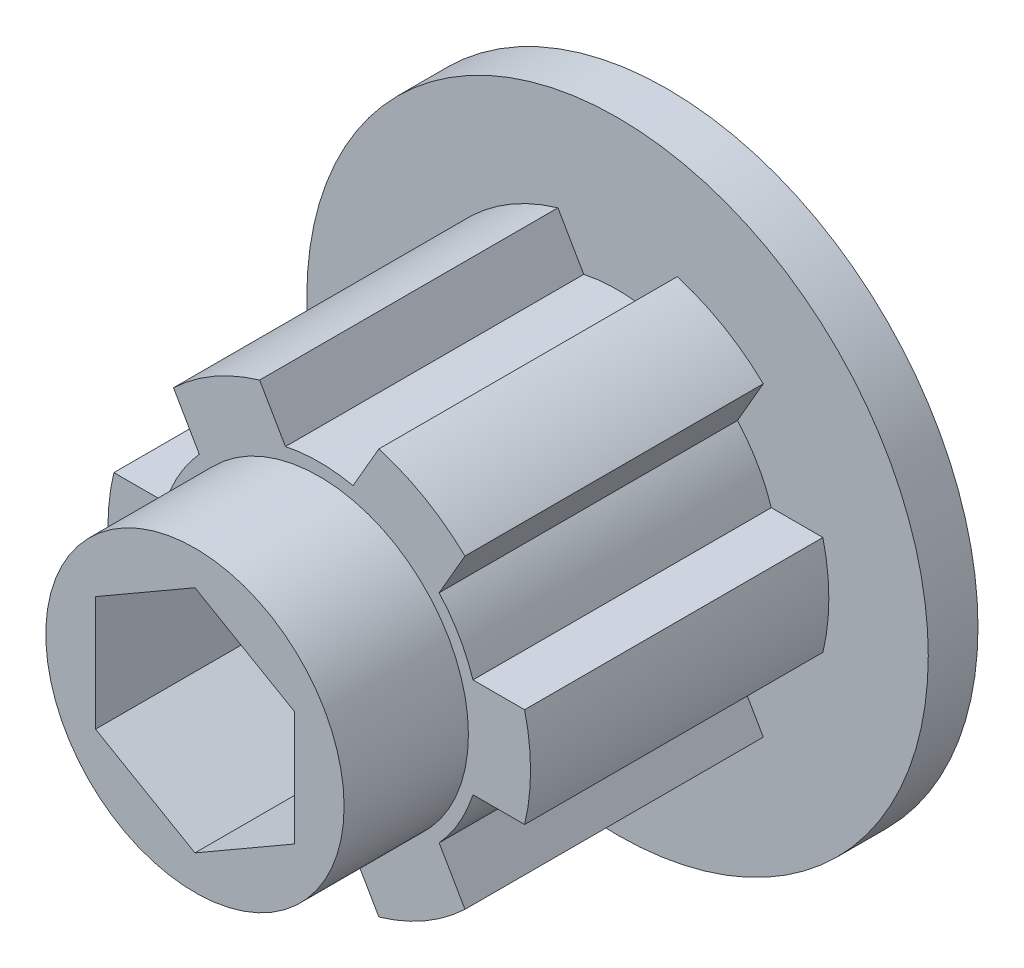
ISO-10303-21;
HEADER;
FILE_DESCRIPTION(('STEP AP214'),'2;1');
FILE_NAME('part.step','',(''),(''),'','','');
FILE_SCHEMA(('AUTOMOTIVE_DESIGN { 1 0 10303 214 1 1 1 1 }'));
ENDSEC;
DATA;
#1=APPLICATION_CONTEXT('core data for automotive mechanical design processes');
#2=APPLICATION_PROTOCOL_DEFINITION('international standard','automotive_design',2000,#1);
#3=PRODUCT_CONTEXT('',#1,'mechanical');
#4=PRODUCT('Part','Part','',(#3));
#5=PRODUCT_RELATED_PRODUCT_CATEGORY('part','',(#4));
#6=PRODUCT_DEFINITION_FORMATION('','',#4);
#7=PRODUCT_DEFINITION_CONTEXT('part definition',#1,'design');
#8=PRODUCT_DEFINITION('design','',#6,#7);
#9=PRODUCT_DEFINITION_SHAPE('','',#8);
#10=(LENGTH_UNIT() NAMED_UNIT(*) SI_UNIT(.MILLI.,.METRE.));
#11=(NAMED_UNIT(*) PLANE_ANGLE_UNIT() SI_UNIT($,.RADIAN.));
#12=(NAMED_UNIT(*) SI_UNIT($,.STERADIAN.) SOLID_ANGLE_UNIT());
#13=UNCERTAINTY_MEASURE_WITH_UNIT(LENGTH_MEASURE(1.E-05),#10,'distance_accuracy_value','');
#14=(GEOMETRIC_REPRESENTATION_CONTEXT(3) GLOBAL_UNCERTAINTY_ASSIGNED_CONTEXT((#13)) GLOBAL_UNIT_ASSIGNED_CONTEXT((#10,
#11,#12)) REPRESENTATION_CONTEXT('',''));
#15=CARTESIAN_POINT('',(0.,0.,0.));
#16=DIRECTION('',(0.,0.,1.));
#17=DIRECTION('',(1.,0.,0.));
#18=AXIS2_PLACEMENT_3D('',#15,#16,#17);
#19=CARTESIAN_POINT('',(0.,0.,2.));
#20=DIRECTION('',(0.,0.,1.));
#21=DIRECTION('',(1.,0.,0.));
#22=AXIS2_PLACEMENT_3D('',#19,#20,#21);
#23=PLANE('',#22);
#24=CARTESIAN_POINT('',(0.,0.,2.));
#25=DIRECTION('',(0.,0.,1.));
#26=DIRECTION('',(1.,0.,0.));
#27=AXIS2_PLACEMENT_3D('',#24,#25,#26);
#28=CIRCLE('',#27,12.5);
#29=CARTESIAN_POINT('',(12.5,0.,2.));
#30=VERTEX_POINT('',#29);
#31=EDGE_CURVE('E26',#30,#30,#28,.T.);
#32=ORIENTED_EDGE('',*,*,#31,.T.);
#33=EDGE_LOOP('',(#32));
#34=FACE_BOUND('',#33,.T.);
#35=CARTESIAN_POINT('',(0.,0.,2.));
#36=DIRECTION('',(0.,0.,1.));
#37=DIRECTION('',(1.,0.,0.));
#38=AXIS2_PLACEMENT_3D('',#35,#36,#37);
#39=CIRCLE('',#38,6.5);
#40=CARTESIAN_POINT('',(1.36027841164437,6.35607132140714,2.));
#41=VERTEX_POINT('',#40);
#42=CARTESIAN_POINT('',(-1.36027841164437,6.35607132140714,2.));
#43=VERTEX_POINT('',#42);
#44=EDGE_CURVE('E511',#41,#43,#39,.T.);
#45=ORIENTED_EDGE('',*,*,#44,.F.);
#46=DIRECTION('',(0.5,0.866025403784439,0.));
#47=VECTOR('',#46,1.);
#48=CARTESIAN_POINT('',(1.87945275727004,7.25530766601711,2.));
#49=LINE('',#48,#47);
#50=CARTESIAN_POINT('',(2.3986271028957,8.15454401062709,2.));
#51=VERTEX_POINT('',#50);
#52=EDGE_CURVE('E356',#41,#51,#49,.T.);
#53=ORIENTED_EDGE('',*,*,#52,.T.);
#54=CARTESIAN_POINT('',(0.,0.,2.));
#55=DIRECTION('',(0.,0.,1.));
#56=DIRECTION('',(1.,0.,0.));
#57=AXIS2_PLACEMENT_3D('',#54,#55,#56);
#58=CIRCLE('',#57,8.5);
#59=CARTESIAN_POINT('',(5.86272871803346,6.15454401062709,2.));
#60=VERTEX_POINT('',#59);
#61=EDGE_CURVE('E444',#60,#51,#58,.T.);
#62=ORIENTED_EDGE('',*,*,#61,.F.);
#63=DIRECTION('',(0.5,0.866025403784439,0.));
#64=VECTOR('',#63,1.);
#65=CARTESIAN_POINT('',(5.34355437240779,5.25530766601711,2.));
#66=LINE('',#65,#64);
#67=CARTESIAN_POINT('',(4.82438002678212,4.35607132140714,2.));
#68=VERTEX_POINT('',#67);
#69=EDGE_CURVE('E440',#68,#60,#66,.T.);
#70=ORIENTED_EDGE('',*,*,#69,.F.);
#71=CARTESIAN_POINT('',(0.,0.,2.));
#72=DIRECTION('',(0.,0.,1.));
#73=DIRECTION('',(1.,0.,0.));
#74=AXIS2_PLACEMENT_3D('',#71,#72,#73);
#75=CIRCLE('',#74,6.5);
#76=CARTESIAN_POINT('',(6.18465843842649,2.,2.));
#77=VERTEX_POINT('',#76);
#78=EDGE_CURVE('E507',#77,#68,#75,.T.);
#79=ORIENTED_EDGE('',*,*,#78,.F.);
#80=DIRECTION('',(1.,0.,0.));
#81=VECTOR('',#80,1.);
#82=CARTESIAN_POINT('',(7.22300712967782,2.,2.));
#83=LINE('',#82,#81);
#84=CARTESIAN_POINT('',(8.26135582092915,2.,2.));
#85=VERTEX_POINT('',#84);
#86=EDGE_CURVE('E492',#77,#85,#83,.T.);
#87=ORIENTED_EDGE('',*,*,#86,.T.);
#88=CARTESIAN_POINT('',(0.,0.,2.));
#89=DIRECTION('',(0.,0.,1.));
#90=DIRECTION('',(1.,0.,0.));
#91=AXIS2_PLACEMENT_3D('',#88,#89,#90);
#92=CIRCLE('',#91,8.5);
#93=CARTESIAN_POINT('',(8.26135582092915,-2.,2.));
#94=VERTEX_POINT('',#93);
#95=EDGE_CURVE('E499',#94,#85,#92,.T.);
#96=ORIENTED_EDGE('',*,*,#95,.F.);
#97=DIRECTION('',(1.,0.,0.));
#98=VECTOR('',#97,1.);
#99=CARTESIAN_POINT('',(7.22300712967782,-2.,2.));
#100=LINE('',#99,#98);
#101=CARTESIAN_POINT('',(6.18465843842649,-2.,2.));
#102=VERTEX_POINT('',#101);
#103=EDGE_CURVE('E495',#102,#94,#100,.T.);
#104=ORIENTED_EDGE('',*,*,#103,.F.);
#105=CARTESIAN_POINT('',(0.,0.,2.));
#106=DIRECTION('',(0.,0.,1.));
#107=DIRECTION('',(1.,0.,0.));
#108=AXIS2_PLACEMENT_3D('',#105,#106,#107);
#109=CIRCLE('',#108,6.5);
#110=CARTESIAN_POINT('',(4.82438002678213,-4.35607132140713,2.));
#111=VERTEX_POINT('',#110);
#112=EDGE_CURVE('E503',#111,#102,#109,.T.);
#113=ORIENTED_EDGE('',*,*,#112,.F.);
#114=DIRECTION('',(0.5,-0.866025403784439,0.));
#115=VECTOR('',#114,1.);
#116=CARTESIAN_POINT('',(5.34355437240779,-5.25530766601711,2.));
#117=LINE('',#116,#115);
#118=CARTESIAN_POINT('',(5.86272871803346,-6.15454401062709,2.));
#119=VERTEX_POINT('',#118);
#120=EDGE_CURVE('E489',#111,#119,#117,.T.);
#121=ORIENTED_EDGE('',*,*,#120,.T.);
#122=CARTESIAN_POINT('',(0.,0.,2.));
#123=DIRECTION('',(0.,0.,1.));
#124=DIRECTION('',(1.,0.,0.));
#125=AXIS2_PLACEMENT_3D('',#122,#123,#124);
#126=CIRCLE('',#125,8.5);
#127=CARTESIAN_POINT('',(2.3986271028957,-8.15454401062709,2.));
#128=VERTEX_POINT('',#127);
#129=EDGE_CURVE('E485',#128,#119,#126,.T.);
#130=ORIENTED_EDGE('',*,*,#129,.F.);
#131=DIRECTION('',(0.5,-0.866025403784439,0.));
#132=VECTOR('',#131,1.);
#133=CARTESIAN_POINT('',(1.87945275727004,-7.25530766601711,2.));
#134=LINE('',#133,#132);
#135=CARTESIAN_POINT('',(1.36027841164436,-6.35607132140714,2.));
#136=VERTEX_POINT('',#135);
#137=EDGE_CURVE('E481',#136,#128,#134,.T.);
#138=ORIENTED_EDGE('',*,*,#137,.F.);
#139=CARTESIAN_POINT('',(0.,0.,2.));
#140=DIRECTION('',(0.,0.,1.));
#141=DIRECTION('',(1.,0.,0.));
#142=AXIS2_PLACEMENT_3D('',#139,#140,#141);
#143=CIRCLE('',#142,6.5);
#144=CARTESIAN_POINT('',(-1.36027841164437,-6.35607132140714,2.));
#145=VERTEX_POINT('',#144);
#146=EDGE_CURVE('E363',#145,#136,#143,.T.);
#147=ORIENTED_EDGE('',*,*,#146,.F.);
#148=DIRECTION('',(-0.5,-0.866025403784439,0.));
#149=VECTOR('',#148,1.);
#150=CARTESIAN_POINT('',(-1.87945275727004,-7.25530766601711,2.));
#151=LINE('',#150,#149);
#152=CARTESIAN_POINT('',(-2.39862710289571,-8.15454401062709,2.));
#153=VERTEX_POINT('',#152);
#154=EDGE_CURVE('E470',#145,#153,#151,.T.);
#155=ORIENTED_EDGE('',*,*,#154,.T.);
#156=CARTESIAN_POINT('',(0.,0.,2.));
#157=DIRECTION('',(0.,0.,1.));
#158=DIRECTION('',(1.,0.,0.));
#159=AXIS2_PLACEMENT_3D('',#156,#157,#158);
#160=CIRCLE('',#159,8.5);
#161=CARTESIAN_POINT('',(-5.86272871803346,-6.15454401062709,2.));
#162=VERTEX_POINT('',#161);
#163=EDGE_CURVE('E477',#162,#153,#160,.T.);
#164=ORIENTED_EDGE('',*,*,#163,.F.);
#165=DIRECTION('',(-0.5,-0.866025403784439,0.));
#166=VECTOR('',#165,1.);
#167=CARTESIAN_POINT('',(-5.34355437240779,-5.25530766601711,2.));
#168=LINE('',#167,#166);
#169=CARTESIAN_POINT('',(-4.82438002678212,-4.35607132140713,2.));
#170=VERTEX_POINT('',#169);
#171=EDGE_CURVE('E473',#170,#162,#168,.T.);
#172=ORIENTED_EDGE('',*,*,#171,.F.);
#173=CARTESIAN_POINT('',(0.,0.,2.));
#174=DIRECTION('',(0.,0.,1.));
#175=DIRECTION('',(1.,0.,0.));
#176=AXIS2_PLACEMENT_3D('',#173,#174,#175);
#177=CIRCLE('',#176,6.5);
#178=CARTESIAN_POINT('',(-6.18465843842649,-2.,2.));
#179=VERTEX_POINT('',#178);
#180=EDGE_CURVE('E519',#179,#170,#177,.T.);
#181=ORIENTED_EDGE('',*,*,#180,.F.);
#182=DIRECTION('',(-1.,0.,0.));
#183=VECTOR('',#182,1.);
#184=CARTESIAN_POINT('',(-7.22300712967782,-2.,2.));
#185=LINE('',#184,#183);
#186=CARTESIAN_POINT('',(-8.26135582092916,-2.,2.));
#187=VERTEX_POINT('',#186);
#188=EDGE_CURVE('E467',#179,#187,#185,.T.);
#189=ORIENTED_EDGE('',*,*,#188,.T.);
#190=CARTESIAN_POINT('',(0.,0.,2.));
#191=DIRECTION('',(0.,0.,1.));
#192=DIRECTION('',(1.,0.,0.));
#193=AXIS2_PLACEMENT_3D('',#190,#191,#192);
#194=CIRCLE('',#193,8.5);
#195=CARTESIAN_POINT('',(-8.26135582092915,2.,2.));
#196=VERTEX_POINT('',#195);
#197=EDGE_CURVE('E463',#196,#187,#194,.T.);
#198=ORIENTED_EDGE('',*,*,#197,.F.);
#199=DIRECTION('',(-1.,0.,0.));
#200=VECTOR('',#199,1.);
#201=CARTESIAN_POINT('',(-7.22300712967782,2.,2.));
#202=LINE('',#201,#200);
#203=CARTESIAN_POINT('',(-6.18465843842649,2.,2.));
#204=VERTEX_POINT('',#203);
#205=EDGE_CURVE('E459',#204,#196,#202,.T.);
#206=ORIENTED_EDGE('',*,*,#205,.F.);
#207=CARTESIAN_POINT('',(0.,0.,2.));
#208=DIRECTION('',(0.,0.,1.));
#209=DIRECTION('',(1.,0.,0.));
#210=AXIS2_PLACEMENT_3D('',#207,#208,#209);
#211=CIRCLE('',#210,6.5);
#212=CARTESIAN_POINT('',(-4.82438002678212,4.35607132140714,2.));
#213=VERTEX_POINT('',#212);
#214=EDGE_CURVE('E515',#213,#204,#211,.T.);
#215=ORIENTED_EDGE('',*,*,#214,.F.);
#216=DIRECTION('',(-0.5,0.866025403784439,0.));
#217=VECTOR('',#216,1.);
#218=CARTESIAN_POINT('',(-5.34355437240779,5.25530766601711,2.));
#219=LINE('',#218,#217);
#220=CARTESIAN_POINT('',(-5.86272871803345,6.15454401062709,2.));
#221=VERTEX_POINT('',#220);
#222=EDGE_CURVE('E448',#213,#221,#219,.T.);
#223=ORIENTED_EDGE('',*,*,#222,.T.);
#224=CARTESIAN_POINT('',(0.,0.,2.));
#225=DIRECTION('',(0.,0.,1.));
#226=DIRECTION('',(1.,0.,0.));
#227=AXIS2_PLACEMENT_3D('',#224,#225,#226);
#228=CIRCLE('',#227,8.5);
#229=CARTESIAN_POINT('',(-2.3986271028957,8.15454401062709,2.));
#230=VERTEX_POINT('',#229);
#231=EDGE_CURVE('E455',#230,#221,#228,.T.);
#232=ORIENTED_EDGE('',*,*,#231,.F.);
#233=DIRECTION('',(-0.5,0.866025403784439,0.));
#234=VECTOR('',#233,1.);
#235=CARTESIAN_POINT('',(-1.87945275727004,7.25530766601712,2.));
#236=LINE('',#235,#234);
#237=EDGE_CURVE('E451',#43,#230,#236,.T.);
#238=ORIENTED_EDGE('',*,*,#237,.F.);
#239=EDGE_LOOP('',(#45,#53,#62,#70,#79,#87,#96,#104,#113,#121,#130,#138,#147,#155,#164,#172,
#181,#189,#198,#206,#215,#223,#232,#238));
#240=FACE_BOUND('',#239,.T.);
#241=ADVANCED_FACE('F16',(#34,#240),#23,.T.);
#242=CARTESIAN_POINT('',(0.,0.,2.));
#243=DIRECTION('',(0.,0.,-1.));
#244=DIRECTION('',(-1.,0.,0.));
#245=AXIS2_PLACEMENT_3D('',#242,#243,#244);
#246=CYLINDRICAL_SURFACE('',#245,12.5);
#247=ORIENTED_EDGE('',*,*,#31,.F.);
#248=EDGE_LOOP('',(#247));
#249=FACE_BOUND('',#248,.T.);
#250=CARTESIAN_POINT('',(0.,0.,0.));
#251=DIRECTION('',(0.,0.,1.));
#252=DIRECTION('',(1.,0.,0.));
#253=AXIS2_PLACEMENT_3D('',#250,#251,#252);
#254=CIRCLE('',#253,12.5);
#255=CARTESIAN_POINT('',(12.5,0.,0.));
#256=VERTEX_POINT('',#255);
#257=EDGE_CURVE('E20',#256,#256,#254,.T.);
#258=ORIENTED_EDGE('',*,*,#257,.T.);
#259=EDGE_LOOP('',(#258));
#260=FACE_BOUND('',#259,.T.);
#261=ADVANCED_FACE('F18',(#249,#260),#246,.T.);
#262=CARTESIAN_POINT('',(0.,0.,0.));
#263=DIRECTION('',(0.,0.,1.));
#264=DIRECTION('',(1.,0.,0.));
#265=AXIS2_PLACEMENT_3D('',#262,#263,#264);
#266=PLANE('',#265);
#267=DIRECTION('',(-0.866025403784438,0.5,0.));
#268=VECTOR('',#267,1.);
#269=CARTESIAN_POINT('',(2.,3.46410161513775,0.));
#270=LINE('',#269,#268);
#271=CARTESIAN_POINT('',(4.,2.3094010767585,0.));
#272=VERTEX_POINT('',#271);
#273=CARTESIAN_POINT('',(0.,4.61880215351701,0.));
#274=VERTEX_POINT('',#273);
#275=EDGE_CURVE('E304',#272,#274,#270,.T.);
#276=ORIENTED_EDGE('',*,*,#275,.T.);
#277=DIRECTION('',(-0.866025403784439,-0.5,0.));
#278=VECTOR('',#277,1.);
#279=CARTESIAN_POINT('',(-2.,3.46410161513775,0.));
#280=LINE('',#279,#278);
#281=CARTESIAN_POINT('',(-4.,2.30940107675851,0.));
#282=VERTEX_POINT('',#281);
#283=EDGE_CURVE('E39',#274,#282,#280,.T.);
#284=ORIENTED_EDGE('',*,*,#283,.T.);
#285=DIRECTION('',(0.,-1.,0.));
#286=VECTOR('',#285,1.);
#287=CARTESIAN_POINT('',(-4.,0.,0.));
#288=LINE('',#287,#286);
#289=CARTESIAN_POINT('',(-4.,-2.30940107675851,0.));
#290=VERTEX_POINT('',#289);
#291=EDGE_CURVE('E291',#282,#290,#288,.T.);
#292=ORIENTED_EDGE('',*,*,#291,.T.);
#293=DIRECTION('',(0.866025403784439,-0.5,0.));
#294=VECTOR('',#293,1.);
#295=CARTESIAN_POINT('',(-2.,-3.46410161513775,0.));
#296=LINE('',#295,#294);
#297=CARTESIAN_POINT('',(0.,-4.61880215351701,0.));
#298=VERTEX_POINT('',#297);
#299=EDGE_CURVE('E297',#290,#298,#296,.T.);
#300=ORIENTED_EDGE('',*,*,#299,.T.);
#301=DIRECTION('',(0.866025403784439,0.5,0.));
#302=VECTOR('',#301,1.);
#303=CARTESIAN_POINT('',(2.,-3.46410161513775,0.));
#304=LINE('',#303,#302);
#305=CARTESIAN_POINT('',(4.,-2.30940107675851,0.));
#306=VERTEX_POINT('',#305);
#307=EDGE_CURVE('E317',#298,#306,#304,.T.);
#308=ORIENTED_EDGE('',*,*,#307,.T.);
#309=DIRECTION('',(0.,1.,0.));
#310=VECTOR('',#309,1.);
#311=CARTESIAN_POINT('',(4.,0.,0.));
#312=LINE('',#311,#310);
#313=EDGE_CURVE('E321',#306,#272,#312,.T.);
#314=ORIENTED_EDGE('',*,*,#313,.T.);
#315=EDGE_LOOP('',(#276,#284,#292,#300,#308,#314));
#316=FACE_BOUND('',#315,.T.);
#317=ORIENTED_EDGE('',*,*,#257,.F.);
#318=EDGE_LOOP('',(#317));
#319=FACE_BOUND('',#318,.T.);
#320=ADVANCED_FACE('F300',(#316,#319),#266,.F.);
#321=CARTESIAN_POINT('',(1.87945275727004,7.25530766601711,14.));
#322=DIRECTION('',(-0.866025403784438,0.5,0.));
#323=DIRECTION('',(-0.5,-0.866025403784439,0.));
#324=AXIS2_PLACEMENT_3D('',#321,#322,#323);
#325=PLANE('',#324);
#326=ORIENTED_EDGE('',*,*,#52,.F.);
#327=DIRECTION('',(0.,0.,-1.));
#328=VECTOR('',#327,1.);
#329=CARTESIAN_POINT('',(1.36027841164437,6.35607132140714,14.));
#330=LINE('',#329,#328);
#331=CARTESIAN_POINT('',(1.36027841164437,6.35607132140714,14.));
#332=VERTEX_POINT('',#331);
#333=EDGE_CURVE('E604',#332,#41,#330,.T.);
#334=ORIENTED_EDGE('',*,*,#333,.F.);
#335=DIRECTION('',(0.5,0.866025403784439,0.));
#336=VECTOR('',#335,1.);
#337=CARTESIAN_POINT('',(1.87945275727004,7.25530766601711,14.));
#338=LINE('',#337,#336);
#339=CARTESIAN_POINT('',(2.3986271028957,8.15454401062709,14.));
#340=VERTEX_POINT('',#339);
#341=EDGE_CURVE('E358',#332,#340,#338,.T.);
#342=ORIENTED_EDGE('',*,*,#341,.T.);
#343=DIRECTION('',(0.,0.,-1.));
#344=VECTOR('',#343,1.);
#345=CARTESIAN_POINT('',(2.3986271028957,8.15454401062709,14.));
#346=LINE('',#345,#344);
#347=EDGE_CURVE('E437',#340,#51,#346,.T.);
#348=ORIENTED_EDGE('',*,*,#347,.T.);
#349=EDGE_LOOP('',(#326,#334,#342,#348));
#350=FACE_BOUND('',#349,.T.);
#351=ADVANCED_FACE('F632',(#350),#325,.T.);
#352=CARTESIAN_POINT('',(0.,0.,14.));
#353=DIRECTION('',(0.,0.,-1.));
#354=DIRECTION('',(-1.,0.,0.));
#355=AXIS2_PLACEMENT_3D('',#352,#353,#354);
#356=CYLINDRICAL_SURFACE('',#355,6.5);
#357=ORIENTED_EDGE('',*,*,#44,.T.);
#358=DIRECTION('',(0.,0.,-1.));
#359=VECTOR('',#358,1.);
#360=CARTESIAN_POINT('',(-1.36027841164437,6.35607132140714,14.));
#361=LINE('',#360,#359);
#362=CARTESIAN_POINT('',(-1.36027841164437,6.35607132140714,14.));
#363=VERTEX_POINT('',#362);
#364=EDGE_CURVE('E600',#363,#43,#361,.T.);
#365=ORIENTED_EDGE('',*,*,#364,.F.);
#366=CARTESIAN_POINT('',(0.,0.,14.));
#367=DIRECTION('',(0.,0.,1.));
#368=DIRECTION('',(1.,0.,0.));
#369=AXIS2_PLACEMENT_3D('',#366,#367,#368);
#370=CIRCLE('',#369,6.5);
#371=EDGE_CURVE('E425',#332,#363,#370,.T.);
#372=ORIENTED_EDGE('',*,*,#371,.F.);
#373=ORIENTED_EDGE('',*,*,#333,.T.);
#374=EDGE_LOOP('',(#357,#365,#372,#373));
#375=FACE_BOUND('',#374,.T.);
#376=ADVANCED_FACE('F638',(#375),#356,.T.);
#377=CARTESIAN_POINT('',(-1.87945275727004,7.25530766601712,14.));
#378=DIRECTION('',(-0.866025403784439,-0.5,0.));
#379=DIRECTION('',(0.5,-0.866025403784439,0.));
#380=AXIS2_PLACEMENT_3D('',#377,#378,#379);
#381=PLANE('',#380);
#382=ORIENTED_EDGE('',*,*,#237,.T.);
#383=DIRECTION('',(0.,0.,-1.));
#384=VECTOR('',#383,1.);
#385=CARTESIAN_POINT('',(-2.3986271028957,8.15454401062709,14.));
#386=LINE('',#385,#384);
#387=CARTESIAN_POINT('',(-2.3986271028957,8.15454401062709,14.));
#388=VERTEX_POINT('',#387);
#389=EDGE_CURVE('E596',#388,#230,#386,.T.);
#390=ORIENTED_EDGE('',*,*,#389,.F.);
#391=DIRECTION('',(-0.5,0.866025403784439,0.));
#392=VECTOR('',#391,1.);
#393=CARTESIAN_POINT('',(-1.87945275727004,7.25530766601712,14.));
#394=LINE('',#393,#392);
#395=EDGE_CURVE('E373',#363,#388,#394,.T.);
#396=ORIENTED_EDGE('',*,*,#395,.F.);
#397=ORIENTED_EDGE('',*,*,#364,.T.);
#398=EDGE_LOOP('',(#382,#390,#396,#397));
#399=FACE_BOUND('',#398,.T.);
#400=ADVANCED_FACE('F664',(#399),#381,.F.);
#401=CARTESIAN_POINT('',(0.,0.,14.));
#402=DIRECTION('',(0.,0.,-1.));
#403=DIRECTION('',(-1.,0.,0.));
#404=AXIS2_PLACEMENT_3D('',#401,#402,#403);
#405=CYLINDRICAL_SURFACE('',#404,8.5);
#406=ORIENTED_EDGE('',*,*,#231,.T.);
#407=DIRECTION('',(0.,0.,-1.));
#408=VECTOR('',#407,1.);
#409=CARTESIAN_POINT('',(-5.86272871803345,6.15454401062709,14.));
#410=LINE('',#409,#408);
#411=CARTESIAN_POINT('',(-5.86272871803345,6.15454401062709,14.));
#412=VERTEX_POINT('',#411);
#413=EDGE_CURVE('E592',#412,#221,#410,.T.);
#414=ORIENTED_EDGE('',*,*,#413,.F.);
#415=CARTESIAN_POINT('',(0.,0.,14.));
#416=DIRECTION('',(0.,0.,1.));
#417=DIRECTION('',(1.,0.,0.));
#418=AXIS2_PLACEMENT_3D('',#415,#416,#417);
#419=CIRCLE('',#418,8.5);
#420=EDGE_CURVE('E376',#388,#412,#419,.T.);
#421=ORIENTED_EDGE('',*,*,#420,.F.);
#422=ORIENTED_EDGE('',*,*,#389,.T.);
#423=EDGE_LOOP('',(#406,#414,#421,#422));
#424=FACE_BOUND('',#423,.T.);
#425=ADVANCED_FACE('F662',(#424),#405,.T.);
#426=CARTESIAN_POINT('',(-5.34355437240779,5.25530766601711,14.));
#427=DIRECTION('',(-0.866025403784439,-0.5,0.));
#428=DIRECTION('',(0.5,-0.866025403784439,0.));
#429=AXIS2_PLACEMENT_3D('',#426,#427,#428);
#430=PLANE('',#429);
#431=ORIENTED_EDGE('',*,*,#222,.F.);
#432=DIRECTION('',(0.,0.,-1.));
#433=VECTOR('',#432,1.);
#434=CARTESIAN_POINT('',(-4.82438002678212,4.35607132140714,14.));
#435=LINE('',#434,#433);
#436=CARTESIAN_POINT('',(-4.82438002678212,4.35607132140714,14.));
#437=VERTEX_POINT('',#436);
#438=EDGE_CURVE('E591',#437,#213,#435,.T.);
#439=ORIENTED_EDGE('',*,*,#438,.F.);
#440=DIRECTION('',(-0.5,0.866025403784439,0.));
#441=VECTOR('',#440,1.);
#442=CARTESIAN_POINT('',(-5.34355437240779,5.25530766601711,14.));
#443=LINE('',#442,#441);
#444=EDGE_CURVE('E369',#437,#412,#443,.T.);
#445=ORIENTED_EDGE('',*,*,#444,.T.);
#446=ORIENTED_EDGE('',*,*,#413,.T.);
#447=EDGE_LOOP('',(#431,#439,#445,#446));
#448=FACE_BOUND('',#447,.T.);
#449=ADVANCED_FACE('F658',(#448),#430,.T.);
#450=CARTESIAN_POINT('',(0.,0.,14.));
#451=DIRECTION('',(0.,0.,-1.));
#452=DIRECTION('',(-1.,0.,0.));
#453=AXIS2_PLACEMENT_3D('',#450,#451,#452);
#454=CYLINDRICAL_SURFACE('',#453,6.5);
#455=ORIENTED_EDGE('',*,*,#214,.T.);
#456=DIRECTION('',(0.,0.,-1.));
#457=VECTOR('',#456,1.);
#458=CARTESIAN_POINT('',(-6.18465843842649,2.,14.));
#459=LINE('',#458,#457);
#460=CARTESIAN_POINT('',(-6.18465843842649,2.,14.));
#461=VERTEX_POINT('',#460);
#462=EDGE_CURVE('E587',#461,#204,#459,.T.);
#463=ORIENTED_EDGE('',*,*,#462,.F.);
#464=CARTESIAN_POINT('',(0.,0.,14.));
#465=DIRECTION('',(0.,0.,1.));
#466=DIRECTION('',(1.,0.,0.));
#467=AXIS2_PLACEMENT_3D('',#464,#465,#466);
#468=CIRCLE('',#467,6.5);
#469=EDGE_CURVE('E428',#437,#461,#468,.T.);
#470=ORIENTED_EDGE('',*,*,#469,.F.);
#471=ORIENTED_EDGE('',*,*,#438,.T.);
#472=EDGE_LOOP('',(#455,#463,#470,#471));
#473=FACE_BOUND('',#472,.T.);
#474=ADVANCED_FACE('F661',(#473),#454,.T.);
#475=CARTESIAN_POINT('',(-7.22300712967782,2.,14.));
#476=DIRECTION('',(0.,-1.,0.));
#477=DIRECTION('',(0.,0.,-1.));
#478=AXIS2_PLACEMENT_3D('',#475,#476,#477);
#479=PLANE('',#478);
#480=ORIENTED_EDGE('',*,*,#205,.T.);
#481=DIRECTION('',(0.,0.,-1.));
#482=VECTOR('',#481,1.);
#483=CARTESIAN_POINT('',(-8.26135582092915,2.,14.));
#484=LINE('',#483,#482);
#485=CARTESIAN_POINT('',(-8.26135582092915,2.,14.));
#486=VERTEX_POINT('',#485);
#487=EDGE_CURVE('E583',#486,#196,#484,.T.);
#488=ORIENTED_EDGE('',*,*,#487,.F.);
#489=DIRECTION('',(-1.,0.,0.));
#490=VECTOR('',#489,1.);
#491=CARTESIAN_POINT('',(-7.22300712967782,2.,14.));
#492=LINE('',#491,#490);
#493=EDGE_CURVE('E379',#461,#486,#492,.T.);
#494=ORIENTED_EDGE('',*,*,#493,.F.);
#495=ORIENTED_EDGE('',*,*,#462,.T.);
#496=EDGE_LOOP('',(#480,#488,#494,#495));
#497=FACE_BOUND('',#496,.T.);
#498=ADVANCED_FACE('F671',(#497),#479,.F.);
#499=CARTESIAN_POINT('',(0.,0.,14.));
#500=DIRECTION('',(0.,0.,-1.));
#501=DIRECTION('',(-1.,0.,0.));
#502=AXIS2_PLACEMENT_3D('',#499,#500,#501);
#503=CYLINDRICAL_SURFACE('',#502,8.5);
#504=ORIENTED_EDGE('',*,*,#197,.T.);
#505=DIRECTION('',(0.,0.,-1.));
#506=VECTOR('',#505,1.);
#507=CARTESIAN_POINT('',(-8.26135582092916,-2.,14.));
#508=LINE('',#507,#506);
#509=CARTESIAN_POINT('',(-8.26135582092916,-2.,14.));
#510=VERTEX_POINT('',#509);
#511=EDGE_CURVE('E579',#510,#187,#508,.T.);
#512=ORIENTED_EDGE('',*,*,#511,.F.);
#513=CARTESIAN_POINT('',(0.,0.,14.));
#514=DIRECTION('',(0.,0.,1.));
#515=DIRECTION('',(1.,0.,0.));
#516=AXIS2_PLACEMENT_3D('',#513,#514,#515);
#517=CIRCLE('',#516,8.5);
#518=EDGE_CURVE('E382',#486,#510,#517,.T.);
#519=ORIENTED_EDGE('',*,*,#518,.F.);
#520=ORIENTED_EDGE('',*,*,#487,.T.);
#521=EDGE_LOOP('',(#504,#512,#519,#520));
#522=FACE_BOUND('',#521,.T.);
#523=ADVANCED_FACE('F674',(#522),#503,.T.);
#524=CARTESIAN_POINT('',(-7.22300712967782,-2.,14.));
#525=DIRECTION('',(0.,-1.,0.));
#526=DIRECTION('',(0.,0.,-1.));
#527=AXIS2_PLACEMENT_3D('',#524,#525,#526);
#528=PLANE('',#527);
#529=ORIENTED_EDGE('',*,*,#188,.F.);
#530=DIRECTION('',(0.,0.,-1.));
#531=VECTOR('',#530,1.);
#532=CARTESIAN_POINT('',(-6.18465843842649,-2.,14.));
#533=LINE('',#532,#531);
#534=CARTESIAN_POINT('',(-6.18465843842649,-2.,14.));
#535=VERTEX_POINT('',#534);
#536=EDGE_CURVE('E572',#535,#179,#533,.T.);
#537=ORIENTED_EDGE('',*,*,#536,.F.);
#538=DIRECTION('',(-1.,0.,0.));
#539=VECTOR('',#538,1.);
#540=CARTESIAN_POINT('',(-7.22300712967782,-2.,14.));
#541=LINE('',#540,#539);
#542=EDGE_CURVE('E385',#535,#510,#541,.T.);
#543=ORIENTED_EDGE('',*,*,#542,.T.);
#544=ORIENTED_EDGE('',*,*,#511,.T.);
#545=EDGE_LOOP('',(#529,#537,#543,#544));
#546=FACE_BOUND('',#545,.T.);
#547=ADVANCED_FACE('F678',(#546),#528,.T.);
#548=CARTESIAN_POINT('',(0.,0.,14.));
#549=DIRECTION('',(0.,0.,-1.));
#550=DIRECTION('',(-1.,0.,0.));
#551=AXIS2_PLACEMENT_3D('',#548,#549,#550);
#552=CYLINDRICAL_SURFACE('',#551,6.5);
#553=ORIENTED_EDGE('',*,*,#180,.T.);
#554=DIRECTION('',(0.,0.,-1.));
#555=VECTOR('',#554,1.);
#556=CARTESIAN_POINT('',(-4.82438002678212,-4.35607132140713,14.));
#557=LINE('',#556,#555);
#558=CARTESIAN_POINT('',(-4.82438002678212,-4.35607132140713,14.));
#559=VERTEX_POINT('',#558);
#560=EDGE_CURVE('E568',#559,#170,#557,.T.);
#561=ORIENTED_EDGE('',*,*,#560,.F.);
#562=CARTESIAN_POINT('',(0.,0.,14.));
#563=DIRECTION('',(0.,0.,1.));
#564=DIRECTION('',(1.,0.,0.));
#565=AXIS2_PLACEMENT_3D('',#562,#563,#564);
#566=CIRCLE('',#565,6.5);
#567=EDGE_CURVE('E431',#535,#559,#566,.T.);
#568=ORIENTED_EDGE('',*,*,#567,.F.);
#569=ORIENTED_EDGE('',*,*,#536,.T.);
#570=EDGE_LOOP('',(#553,#561,#568,#569));
#571=FACE_BOUND('',#570,.T.);
#572=ADVANCED_FACE('F682',(#571),#552,.T.);
#573=CARTESIAN_POINT('',(-5.34355437240779,-5.25530766601711,14.));
#574=DIRECTION('',(0.866025403784438,-0.5,0.));
#575=DIRECTION('',(0.5,0.866025403784439,0.));
#576=AXIS2_PLACEMENT_3D('',#573,#574,#575);
#577=PLANE('',#576);
#578=ORIENTED_EDGE('',*,*,#171,.T.);
#579=DIRECTION('',(0.,0.,-1.));
#580=VECTOR('',#579,1.);
#581=CARTESIAN_POINT('',(-5.86272871803346,-6.15454401062709,14.));
#582=LINE('',#581,#580);
#583=CARTESIAN_POINT('',(-5.86272871803346,-6.15454401062709,14.));
#584=VERTEX_POINT('',#583);
#585=EDGE_CURVE('E564',#584,#162,#582,.T.);
#586=ORIENTED_EDGE('',*,*,#585,.F.);
#587=DIRECTION('',(-0.5,-0.866025403784439,0.));
#588=VECTOR('',#587,1.);
#589=CARTESIAN_POINT('',(-5.34355437240779,-5.25530766601711,14.));
#590=LINE('',#589,#588);
#591=EDGE_CURVE('E393',#559,#584,#590,.T.);
#592=ORIENTED_EDGE('',*,*,#591,.F.);
#593=ORIENTED_EDGE('',*,*,#560,.T.);
#594=EDGE_LOOP('',(#578,#586,#592,#593));
#595=FACE_BOUND('',#594,.T.);
#596=ADVANCED_FACE('F690',(#595),#577,.F.);
#597=CARTESIAN_POINT('',(0.,0.,14.));
#598=DIRECTION('',(0.,0.,-1.));
#599=DIRECTION('',(-1.,0.,0.));
#600=AXIS2_PLACEMENT_3D('',#597,#598,#599);
#601=CYLINDRICAL_SURFACE('',#600,8.5);
#602=ORIENTED_EDGE('',*,*,#163,.T.);
#603=DIRECTION('',(0.,0.,-1.));
#604=VECTOR('',#603,1.);
#605=CARTESIAN_POINT('',(-2.39862710289571,-8.15454401062709,14.));
#606=LINE('',#605,#604);
#607=CARTESIAN_POINT('',(-2.39862710289571,-8.15454401062709,14.));
#608=VERTEX_POINT('',#607);
#609=EDGE_CURVE('E560',#608,#153,#606,.T.);
#610=ORIENTED_EDGE('',*,*,#609,.F.);
#611=CARTESIAN_POINT('',(0.,0.,14.));
#612=DIRECTION('',(0.,0.,1.));
#613=DIRECTION('',(1.,0.,0.));
#614=AXIS2_PLACEMENT_3D('',#611,#612,#613);
#615=CIRCLE('',#614,8.5);
#616=EDGE_CURVE('E396',#584,#608,#615,.T.);
#617=ORIENTED_EDGE('',*,*,#616,.F.);
#618=ORIENTED_EDGE('',*,*,#585,.T.);
#619=EDGE_LOOP('',(#602,#610,#617,#618));
#620=FACE_BOUND('',#619,.T.);
#621=ADVANCED_FACE('F688',(#620),#601,.T.);
#622=CARTESIAN_POINT('',(-1.87945275727004,-7.25530766601711,14.));
#623=DIRECTION('',(0.866025403784438,-0.5,0.));
#624=DIRECTION('',(0.5,0.866025403784439,0.));
#625=AXIS2_PLACEMENT_3D('',#622,#623,#624);
#626=PLANE('',#625);
#627=ORIENTED_EDGE('',*,*,#154,.F.);
#628=DIRECTION('',(0.,0.,-1.));
#629=VECTOR('',#628,1.);
#630=CARTESIAN_POINT('',(-1.36027841164437,-6.35607132140714,14.));
#631=LINE('',#630,#629);
#632=CARTESIAN_POINT('',(-1.36027841164437,-6.35607132140714,14.));
#633=VERTEX_POINT('',#632);
#634=EDGE_CURVE('E559',#633,#145,#631,.T.);
#635=ORIENTED_EDGE('',*,*,#634,.F.);
#636=DIRECTION('',(-0.5,-0.866025403784439,0.));
#637=VECTOR('',#636,1.);
#638=CARTESIAN_POINT('',(-1.87945275727004,-7.25530766601711,14.));
#639=LINE('',#638,#637);
#640=EDGE_CURVE('E389',#633,#608,#639,.T.);
#641=ORIENTED_EDGE('',*,*,#640,.T.);
#642=ORIENTED_EDGE('',*,*,#609,.T.);
#643=EDGE_LOOP('',(#627,#635,#641,#642));
#644=FACE_BOUND('',#643,.T.);
#645=ADVANCED_FACE('F684',(#644),#626,.T.);
#646=CARTESIAN_POINT('',(0.,0.,14.));
#647=DIRECTION('',(0.,0.,-1.));
#648=DIRECTION('',(-1.,0.,0.));
#649=AXIS2_PLACEMENT_3D('',#646,#647,#648);
#650=CYLINDRICAL_SURFACE('',#649,6.5);
#651=ORIENTED_EDGE('',*,*,#146,.T.);
#652=DIRECTION('',(0.,0.,-1.));
#653=VECTOR('',#652,1.);
#654=CARTESIAN_POINT('',(1.36027841164436,-6.35607132140714,14.));
#655=LINE('',#654,#653);
#656=CARTESIAN_POINT('',(1.36027841164436,-6.35607132140714,14.));
#657=VERTEX_POINT('',#656);
#658=EDGE_CURVE('E555',#657,#136,#655,.T.);
#659=ORIENTED_EDGE('',*,*,#658,.F.);
#660=CARTESIAN_POINT('',(0.,0.,14.));
#661=DIRECTION('',(0.,0.,1.));
#662=DIRECTION('',(1.,0.,0.));
#663=AXIS2_PLACEMENT_3D('',#660,#661,#662);
#664=CIRCLE('',#663,6.5);
#665=EDGE_CURVE('E434',#633,#657,#664,.T.);
#666=ORIENTED_EDGE('',*,*,#665,.F.);
#667=ORIENTED_EDGE('',*,*,#634,.T.);
#668=EDGE_LOOP('',(#651,#659,#666,#667));
#669=FACE_BOUND('',#668,.T.);
#670=ADVANCED_FACE('F687',(#669),#650,.T.);
#671=CARTESIAN_POINT('',(1.87945275727004,-7.25530766601711,14.));
#672=DIRECTION('',(0.866025403784438,0.5,0.));
#673=DIRECTION('',(-0.5,0.866025403784439,0.));
#674=AXIS2_PLACEMENT_3D('',#671,#672,#673);
#675=PLANE('',#674);
#676=ORIENTED_EDGE('',*,*,#137,.T.);
#677=DIRECTION('',(0.,0.,-1.));
#678=VECTOR('',#677,1.);
#679=CARTESIAN_POINT('',(2.3986271028957,-8.15454401062709,14.));
#680=LINE('',#679,#678);
#681=CARTESIAN_POINT('',(2.3986271028957,-8.15454401062709,14.));
#682=VERTEX_POINT('',#681);
#683=EDGE_CURVE('E551',#682,#128,#680,.T.);
#684=ORIENTED_EDGE('',*,*,#683,.F.);
#685=DIRECTION('',(0.5,-0.866025403784439,0.));
#686=VECTOR('',#685,1.);
#687=CARTESIAN_POINT('',(1.87945275727004,-7.25530766601711,14.));
#688=LINE('',#687,#686);
#689=EDGE_CURVE('E399',#657,#682,#688,.T.);
#690=ORIENTED_EDGE('',*,*,#689,.F.);
#691=ORIENTED_EDGE('',*,*,#658,.T.);
#692=EDGE_LOOP('',(#676,#684,#690,#691));
#693=FACE_BOUND('',#692,.T.);
#694=ADVANCED_FACE('F697',(#693),#675,.F.);
#695=CARTESIAN_POINT('',(0.,0.,14.));
#696=DIRECTION('',(0.,0.,-1.));
#697=DIRECTION('',(-1.,0.,0.));
#698=AXIS2_PLACEMENT_3D('',#695,#696,#697);
#699=CYLINDRICAL_SURFACE('',#698,8.5);
#700=ORIENTED_EDGE('',*,*,#129,.T.);
#701=DIRECTION('',(0.,0.,-1.));
#702=VECTOR('',#701,1.);
#703=CARTESIAN_POINT('',(5.86272871803346,-6.15454401062709,14.));
#704=LINE('',#703,#702);
#705=CARTESIAN_POINT('',(5.86272871803346,-6.15454401062709,14.));
#706=VERTEX_POINT('',#705);
#707=EDGE_CURVE('E547',#706,#119,#704,.T.);
#708=ORIENTED_EDGE('',*,*,#707,.F.);
#709=CARTESIAN_POINT('',(0.,0.,14.));
#710=DIRECTION('',(0.,0.,1.));
#711=DIRECTION('',(1.,0.,0.));
#712=AXIS2_PLACEMENT_3D('',#709,#710,#711);
#713=CIRCLE('',#712,8.5);
#714=EDGE_CURVE('E402',#682,#706,#713,.T.);
#715=ORIENTED_EDGE('',*,*,#714,.F.);
#716=ORIENTED_EDGE('',*,*,#683,.T.);
#717=EDGE_LOOP('',(#700,#708,#715,#716));
#718=FACE_BOUND('',#717,.T.);
#719=ADVANCED_FACE('F700',(#718),#699,.T.);
#720=CARTESIAN_POINT('',(5.34355437240779,-5.25530766601711,14.));
#721=DIRECTION('',(0.866025403784438,0.5,0.));
#722=DIRECTION('',(-0.5,0.866025403784439,0.));
#723=AXIS2_PLACEMENT_3D('',#720,#721,#722);
#724=PLANE('',#723);
#725=ORIENTED_EDGE('',*,*,#120,.F.);
#726=DIRECTION('',(0.,0.,-1.));
#727=VECTOR('',#726,1.);
#728=CARTESIAN_POINT('',(4.82438002678213,-4.35607132140713,14.));
#729=LINE('',#728,#727);
#730=CARTESIAN_POINT('',(4.82438002678213,-4.35607132140713,14.));
#731=VERTEX_POINT('',#730);
#732=EDGE_CURVE('E539',#731,#111,#729,.T.);
#733=ORIENTED_EDGE('',*,*,#732,.F.);
#734=DIRECTION('',(0.5,-0.866025403784439,0.));
#735=VECTOR('',#734,1.);
#736=CARTESIAN_POINT('',(5.34355437240779,-5.25530766601711,14.));
#737=LINE('',#736,#735);
#738=EDGE_CURVE('E405',#731,#706,#737,.T.);
#739=ORIENTED_EDGE('',*,*,#738,.T.);
#740=ORIENTED_EDGE('',*,*,#707,.T.);
#741=EDGE_LOOP('',(#725,#733,#739,#740));
#742=FACE_BOUND('',#741,.T.);
#743=ADVANCED_FACE('F704',(#742),#724,.T.);
#744=CARTESIAN_POINT('',(0.,0.,14.));
#745=DIRECTION('',(0.,0.,-1.));
#746=DIRECTION('',(-1.,0.,0.));
#747=AXIS2_PLACEMENT_3D('',#744,#745,#746);
#748=CYLINDRICAL_SURFACE('',#747,6.5);
#749=ORIENTED_EDGE('',*,*,#112,.T.);
#750=DIRECTION('',(0.,0.,-1.));
#751=VECTOR('',#750,1.);
#752=CARTESIAN_POINT('',(6.18465843842649,-2.,14.));
#753=LINE('',#752,#751);
#754=CARTESIAN_POINT('',(6.18465843842649,-2.,14.));
#755=VERTEX_POINT('',#754);
#756=EDGE_CURVE('E535',#755,#102,#753,.T.);
#757=ORIENTED_EDGE('',*,*,#756,.F.);
#758=CARTESIAN_POINT('',(0.,0.,14.));
#759=DIRECTION('',(0.,0.,1.));
#760=DIRECTION('',(1.,0.,0.));
#761=AXIS2_PLACEMENT_3D('',#758,#759,#760);
#762=CIRCLE('',#761,6.5);
#763=EDGE_CURVE('E419',#731,#755,#762,.T.);
#764=ORIENTED_EDGE('',*,*,#763,.F.);
#765=ORIENTED_EDGE('',*,*,#732,.T.);
#766=EDGE_LOOP('',(#749,#757,#764,#765));
#767=FACE_BOUND('',#766,.T.);
#768=ADVANCED_FACE('F708',(#767),#748,.T.);
#769=CARTESIAN_POINT('',(7.22300712967782,-2.,14.));
#770=DIRECTION('',(0.,1.,0.));
#771=DIRECTION('',(0.,0.,1.));
#772=AXIS2_PLACEMENT_3D('',#769,#770,#771);
#773=PLANE('',#772);
#774=ORIENTED_EDGE('',*,*,#103,.T.);
#775=DIRECTION('',(0.,0.,-1.));
#776=VECTOR('',#775,1.);
#777=CARTESIAN_POINT('',(8.26135582092915,-2.,14.));
#778=LINE('',#777,#776);
#779=CARTESIAN_POINT('',(8.26135582092915,-2.,14.));
#780=VERTEX_POINT('',#779);
#781=EDGE_CURVE('E530',#780,#94,#778,.T.);
#782=ORIENTED_EDGE('',*,*,#781,.F.);
#783=DIRECTION('',(1.,0.,0.));
#784=VECTOR('',#783,1.);
#785=CARTESIAN_POINT('',(7.22300712967782,-2.,14.));
#786=LINE('',#785,#784);
#787=EDGE_CURVE('E413',#755,#780,#786,.T.);
#788=ORIENTED_EDGE('',*,*,#787,.F.);
#789=ORIENTED_EDGE('',*,*,#756,.T.);
#790=EDGE_LOOP('',(#774,#782,#788,#789));
#791=FACE_BOUND('',#790,.T.);
#792=ADVANCED_FACE('F715',(#791),#773,.F.);
#793=CARTESIAN_POINT('',(0.,0.,14.));
#794=DIRECTION('',(0.,0.,-1.));
#795=DIRECTION('',(-1.,0.,0.));
#796=AXIS2_PLACEMENT_3D('',#793,#794,#795);
#797=CYLINDRICAL_SURFACE('',#796,8.5);
#798=ORIENTED_EDGE('',*,*,#95,.T.);
#799=DIRECTION('',(0.,0.,-1.));
#800=VECTOR('',#799,1.);
#801=CARTESIAN_POINT('',(8.26135582092915,2.,14.));
#802=LINE('',#801,#800);
#803=CARTESIAN_POINT('',(8.26135582092915,2.,14.));
#804=VERTEX_POINT('',#803);
#805=EDGE_CURVE('E526',#804,#85,#802,.T.);
#806=ORIENTED_EDGE('',*,*,#805,.F.);
#807=CARTESIAN_POINT('',(0.,0.,14.));
#808=DIRECTION('',(0.,0.,1.));
#809=DIRECTION('',(1.,0.,0.));
#810=AXIS2_PLACEMENT_3D('',#807,#808,#809);
#811=CIRCLE('',#810,8.5);
#812=EDGE_CURVE('E416',#780,#804,#811,.T.);
#813=ORIENTED_EDGE('',*,*,#812,.F.);
#814=ORIENTED_EDGE('',*,*,#781,.T.);
#815=EDGE_LOOP('',(#798,#806,#813,#814));
#816=FACE_BOUND('',#815,.T.);
#817=ADVANCED_FACE('F713',(#816),#797,.T.);
#818=CARTESIAN_POINT('',(7.22300712967782,2.,14.));
#819=DIRECTION('',(0.,1.,0.));
#820=DIRECTION('',(0.,0.,1.));
#821=AXIS2_PLACEMENT_3D('',#818,#819,#820);
#822=PLANE('',#821);
#823=ORIENTED_EDGE('',*,*,#86,.F.);
#824=DIRECTION('',(0.,0.,-1.));
#825=VECTOR('',#824,1.);
#826=CARTESIAN_POINT('',(6.18465843842649,2.,14.));
#827=LINE('',#826,#825);
#828=CARTESIAN_POINT('',(6.18465843842649,2.,14.));
#829=VERTEX_POINT('',#828);
#830=EDGE_CURVE('E531',#829,#77,#827,.T.);
#831=ORIENTED_EDGE('',*,*,#830,.F.);
#832=DIRECTION('',(1.,0.,0.));
#833=VECTOR('',#832,1.);
#834=CARTESIAN_POINT('',(7.22300712967782,2.,14.));
#835=LINE('',#834,#833);
#836=EDGE_CURVE('E409',#829,#804,#835,.T.);
#837=ORIENTED_EDGE('',*,*,#836,.T.);
#838=ORIENTED_EDGE('',*,*,#805,.T.);
#839=EDGE_LOOP('',(#823,#831,#837,#838));
#840=FACE_BOUND('',#839,.T.);
#841=ADVANCED_FACE('F710',(#840),#822,.T.);
#842=CARTESIAN_POINT('',(0.,0.,14.));
#843=DIRECTION('',(0.,0.,-1.));
#844=DIRECTION('',(-1.,0.,0.));
#845=AXIS2_PLACEMENT_3D('',#842,#843,#844);
#846=CYLINDRICAL_SURFACE('',#845,6.5);
#847=ORIENTED_EDGE('',*,*,#78,.T.);
#848=DIRECTION('',(0.,0.,-1.));
#849=VECTOR('',#848,1.);
#850=CARTESIAN_POINT('',(4.82438002678212,4.35607132140714,14.));
#851=LINE('',#850,#849);
#852=CARTESIAN_POINT('',(4.82438002678212,4.35607132140714,14.));
#853=VERTEX_POINT('',#852);
#854=EDGE_CURVE('E543',#853,#68,#851,.T.);
#855=ORIENTED_EDGE('',*,*,#854,.F.);
#856=CARTESIAN_POINT('',(0.,0.,14.));
#857=DIRECTION('',(0.,0.,1.));
#858=DIRECTION('',(1.,0.,0.));
#859=AXIS2_PLACEMENT_3D('',#856,#857,#858);
#860=CIRCLE('',#859,6.5);
#861=EDGE_CURVE('E422',#829,#853,#860,.T.);
#862=ORIENTED_EDGE('',*,*,#861,.F.);
#863=ORIENTED_EDGE('',*,*,#830,.T.);
#864=EDGE_LOOP('',(#847,#855,#862,#863));
#865=FACE_BOUND('',#864,.T.);
#866=ADVANCED_FACE('F652',(#865),#846,.T.);
#867=CARTESIAN_POINT('',(5.34355437240779,5.25530766601711,14.));
#868=DIRECTION('',(-0.866025403784438,0.5,0.));
#869=DIRECTION('',(-0.5,-0.866025403784439,0.));
#870=AXIS2_PLACEMENT_3D('',#867,#868,#869);
#871=PLANE('',#870);
#872=ORIENTED_EDGE('',*,*,#69,.T.);
#873=DIRECTION('',(0.,0.,-1.));
#874=VECTOR('',#873,1.);
#875=CARTESIAN_POINT('',(5.86272871803346,6.15454401062709,14.));
#876=LINE('',#875,#874);
#877=CARTESIAN_POINT('',(5.86272871803346,6.15454401062709,14.));
#878=VERTEX_POINT('',#877);
#879=EDGE_CURVE('E611',#878,#60,#876,.T.);
#880=ORIENTED_EDGE('',*,*,#879,.F.);
#881=DIRECTION('',(0.5,0.866025403784439,0.));
#882=VECTOR('',#881,1.);
#883=CARTESIAN_POINT('',(5.34355437240779,5.25530766601711,14.));
#884=LINE('',#883,#882);
#885=EDGE_CURVE('E362',#853,#878,#884,.T.);
#886=ORIENTED_EDGE('',*,*,#885,.F.);
#887=ORIENTED_EDGE('',*,*,#854,.T.);
#888=EDGE_LOOP('',(#872,#880,#886,#887));
#889=FACE_BOUND('',#888,.T.);
#890=ADVANCED_FACE('F648',(#889),#871,.F.);
#891=CARTESIAN_POINT('',(0.,0.,14.));
#892=DIRECTION('',(0.,0.,-1.));
#893=DIRECTION('',(-1.,0.,0.));
#894=AXIS2_PLACEMENT_3D('',#891,#892,#893);
#895=CYLINDRICAL_SURFACE('',#894,8.5);
#896=ORIENTED_EDGE('',*,*,#61,.T.);
#897=ORIENTED_EDGE('',*,*,#347,.F.);
#898=CARTESIAN_POINT('',(0.,0.,14.));
#899=DIRECTION('',(0.,0.,1.));
#900=DIRECTION('',(1.,0.,0.));
#901=AXIS2_PLACEMENT_3D('',#898,#899,#900);
#902=CIRCLE('',#901,8.5);
#903=EDGE_CURVE('E366',#878,#340,#902,.T.);
#904=ORIENTED_EDGE('',*,*,#903,.F.);
#905=ORIENTED_EDGE('',*,*,#879,.T.);
#906=EDGE_LOOP('',(#896,#897,#904,#905));
#907=FACE_BOUND('',#906,.T.);
#908=ADVANCED_FACE('F651',(#907),#895,.T.);
#909=CARTESIAN_POINT('',(0.,0.,14.));
#910=DIRECTION('',(0.,0.,1.));
#911=DIRECTION('',(1.,0.,0.));
#912=AXIS2_PLACEMENT_3D('',#909,#910,#911);
#913=PLANE('',#912);
#914=CARTESIAN_POINT('',(0.,0.,14.));
#915=DIRECTION('',(0.,0.,1.));
#916=DIRECTION('',(1.,0.,0.));
#917=AXIS2_PLACEMENT_3D('',#914,#915,#916);
#918=CIRCLE('',#917,6.);
#919=CARTESIAN_POINT('',(6.,0.,14.));
#920=VERTEX_POINT('',#919);
#921=EDGE_CURVE('E10',#920,#920,#918,.T.);
#922=ORIENTED_EDGE('',*,*,#921,.F.);
#923=EDGE_LOOP('',(#922));
#924=FACE_BOUND('',#923,.T.);
#925=ORIENTED_EDGE('',*,*,#341,.F.);
#926=ORIENTED_EDGE('',*,*,#371,.T.);
#927=ORIENTED_EDGE('',*,*,#395,.T.);
#928=ORIENTED_EDGE('',*,*,#420,.T.);
#929=ORIENTED_EDGE('',*,*,#444,.F.);
#930=ORIENTED_EDGE('',*,*,#469,.T.);
#931=ORIENTED_EDGE('',*,*,#493,.T.);
#932=ORIENTED_EDGE('',*,*,#518,.T.);
#933=ORIENTED_EDGE('',*,*,#542,.F.);
#934=ORIENTED_EDGE('',*,*,#567,.T.);
#935=ORIENTED_EDGE('',*,*,#591,.T.);
#936=ORIENTED_EDGE('',*,*,#616,.T.);
#937=ORIENTED_EDGE('',*,*,#640,.F.);
#938=ORIENTED_EDGE('',*,*,#665,.T.);
#939=ORIENTED_EDGE('',*,*,#689,.T.);
#940=ORIENTED_EDGE('',*,*,#714,.T.);
#941=ORIENTED_EDGE('',*,*,#738,.F.);
#942=ORIENTED_EDGE('',*,*,#763,.T.);
#943=ORIENTED_EDGE('',*,*,#787,.T.);
#944=ORIENTED_EDGE('',*,*,#812,.T.);
#945=ORIENTED_EDGE('',*,*,#836,.F.);
#946=ORIENTED_EDGE('',*,*,#861,.T.);
#947=ORIENTED_EDGE('',*,*,#885,.T.);
#948=ORIENTED_EDGE('',*,*,#903,.T.);
#949=EDGE_LOOP('',(#925,#926,#927,#928,#929,#930,#931,#932,#933,#934,#935,#936,#937,#938,#939,
#940,#941,#942,#943,#944,#945,#946,#947,#948));
#950=FACE_BOUND('',#949,.T.);
#951=ADVANCED_FACE('F656',(#924,#950),#913,.T.);
#952=CARTESIAN_POINT('',(0.,0.,19.));
#953=DIRECTION('',(0.,0.,-1.));
#954=DIRECTION('',(-1.,0.,0.));
#955=AXIS2_PLACEMENT_3D('',#952,#953,#954);
#956=CYLINDRICAL_SURFACE('',#955,6.);
#957=CARTESIAN_POINT('',(0.,0.,19.));
#958=DIRECTION('',(0.,0.,1.));
#959=DIRECTION('',(1.,0.,0.));
#960=AXIS2_PLACEMENT_3D('',#957,#958,#959);
#961=CIRCLE('',#960,6.);
#962=CARTESIAN_POINT('',(6.,0.,19.));
#963=VERTEX_POINT('',#962);
#964=EDGE_CURVE('E287',#963,#963,#961,.T.);
#965=ORIENTED_EDGE('',*,*,#964,.F.);
#966=EDGE_LOOP('',(#965));
#967=FACE_BOUND('',#966,.T.);
#968=ORIENTED_EDGE('',*,*,#921,.T.);
#969=EDGE_LOOP('',(#968));
#970=FACE_BOUND('',#969,.T.);
#971=ADVANCED_FACE('F742',(#967,#970),#956,.T.);
#972=CARTESIAN_POINT('',(0.,0.,19.));
#973=DIRECTION('',(0.,0.,1.));
#974=DIRECTION('',(1.,0.,0.));
#975=AXIS2_PLACEMENT_3D('',#972,#973,#974);
#976=PLANE('',#975);
#977=DIRECTION('',(-0.866025403784439,-0.5,0.));
#978=VECTOR('',#977,1.);
#979=CARTESIAN_POINT('',(-2.,3.46410161513775,19.));
#980=LINE('',#979,#978);
#981=CARTESIAN_POINT('',(0.,4.61880215351701,19.));
#982=VERTEX_POINT('',#981);
#983=CARTESIAN_POINT('',(-4.,2.30940107675851,19.));
#984=VERTEX_POINT('',#983);
#985=EDGE_CURVE('E283',#982,#984,#980,.T.);
#986=ORIENTED_EDGE('',*,*,#985,.F.);
#987=DIRECTION('',(-0.866025403784438,0.5,0.));
#988=VECTOR('',#987,1.);
#989=CARTESIAN_POINT('',(2.,3.46410161513775,19.));
#990=LINE('',#989,#988);
#991=CARTESIAN_POINT('',(4.,2.30940107675851,19.));
#992=VERTEX_POINT('',#991);
#993=EDGE_CURVE('E306',#992,#982,#990,.T.);
#994=ORIENTED_EDGE('',*,*,#993,.F.);
#995=DIRECTION('',(0.,1.,0.));
#996=VECTOR('',#995,1.);
#997=CARTESIAN_POINT('',(4.,0.,19.));
#998=LINE('',#997,#996);
#999=CARTESIAN_POINT('',(4.,-2.30940107675851,19.));
#1000=VERTEX_POINT('',#999);
#1001=EDGE_CURVE('E51',#1000,#992,#998,.T.);
#1002=ORIENTED_EDGE('',*,*,#1001,.F.);
#1003=DIRECTION('',(0.866025403784439,0.5,0.));
#1004=VECTOR('',#1003,1.);
#1005=CARTESIAN_POINT('',(2.,-3.46410161513775,19.));
#1006=LINE('',#1005,#1004);
#1007=CARTESIAN_POINT('',(0.,-4.61880215351701,19.));
#1008=VERTEX_POINT('',#1007);
#1009=EDGE_CURVE('E335',#1008,#1000,#1006,.T.);
#1010=ORIENTED_EDGE('',*,*,#1009,.F.);
#1011=DIRECTION('',(0.866025403784439,-0.5,0.));
#1012=VECTOR('',#1011,1.);
#1013=CARTESIAN_POINT('',(-2.,-3.46410161513775,19.));
#1014=LINE('',#1013,#1012);
#1015=CARTESIAN_POINT('',(-4.,-2.30940107675851,19.));
#1016=VERTEX_POINT('',#1015);
#1017=EDGE_CURVE('E331',#1016,#1008,#1014,.T.);
#1018=ORIENTED_EDGE('',*,*,#1017,.F.);
#1019=DIRECTION('',(0.,-1.,0.));
#1020=VECTOR('',#1019,1.);
#1021=CARTESIAN_POINT('',(-4.,0.,19.));
#1022=LINE('',#1021,#1020);
#1023=EDGE_CURVE('E328',#984,#1016,#1022,.T.);
#1024=ORIENTED_EDGE('',*,*,#1023,.F.);
#1025=EDGE_LOOP('',(#986,#994,#1002,#1010,#1018,#1024));
#1026=FACE_BOUND('',#1025,.T.);
#1027=ORIENTED_EDGE('',*,*,#964,.T.);
#1028=EDGE_LOOP('',(#1027));
#1029=FACE_BOUND('',#1028,.T.);
#1030=ADVANCED_FACE('F746',(#1026,#1029),#976,.T.);
#1031=CARTESIAN_POINT('',(-2.,3.46410161513775,0.));
#1032=DIRECTION('',(-0.5,0.866025403784439,0.));
#1033=DIRECTION('',(-0.866025403784439,-0.5,0.));
#1034=AXIS2_PLACEMENT_3D('',#1031,#1032,#1033);
#1035=PLANE('',#1034);
#1036=ORIENTED_EDGE('',*,*,#985,.T.);
#1037=DIRECTION('',(0.,0.,1.));
#1038=VECTOR('',#1037,1.);
#1039=CARTESIAN_POINT('',(-4.,2.30940107675851,0.));
#1040=LINE('',#1039,#1038);
#1041=EDGE_CURVE('E279',#282,#984,#1040,.T.);
#1042=ORIENTED_EDGE('',*,*,#1041,.F.);
#1043=ORIENTED_EDGE('',*,*,#283,.F.);
#1044=DIRECTION('',(0.,0.,1.));
#1045=VECTOR('',#1044,1.);
#1046=CARTESIAN_POINT('',(0.,4.61880215351701,0.));
#1047=LINE('',#1046,#1045);
#1048=EDGE_CURVE('E326',#274,#982,#1047,.T.);
#1049=ORIENTED_EDGE('',*,*,#1048,.T.);
#1050=EDGE_LOOP('',(#1036,#1042,#1043,#1049));
#1051=FACE_BOUND('',#1050,.T.);
#1052=ADVANCED_FACE('F281',(#1051),#1035,.F.);
#1053=CARTESIAN_POINT('',(-4.,0.,0.));
#1054=DIRECTION('',(-1.,0.,0.));
#1055=DIRECTION('',(0.,0.,1.));
#1056=AXIS2_PLACEMENT_3D('',#1053,#1054,#1055);
#1057=PLANE('',#1056);
#1058=ORIENTED_EDGE('',*,*,#1023,.T.);
#1059=DIRECTION('',(0.,0.,1.));
#1060=VECTOR('',#1059,1.);
#1061=CARTESIAN_POINT('',(-4.,-2.30940107675851,0.));
#1062=LINE('',#1061,#1060);
#1063=EDGE_CURVE('E288',#290,#1016,#1062,.T.);
#1064=ORIENTED_EDGE('',*,*,#1063,.F.);
#1065=ORIENTED_EDGE('',*,*,#291,.F.);
#1066=ORIENTED_EDGE('',*,*,#1041,.T.);
#1067=EDGE_LOOP('',(#1058,#1064,#1065,#1066));
#1068=FACE_BOUND('',#1067,.T.);
#1069=ADVANCED_FACE('F292',(#1068),#1057,.F.);
#1070=CARTESIAN_POINT('',(-2.,-3.46410161513775,0.));
#1071=DIRECTION('',(-0.5,-0.866025403784439,0.));
#1072=DIRECTION('',(0.866025403784439,-0.5,0.));
#1073=AXIS2_PLACEMENT_3D('',#1070,#1071,#1072);
#1074=PLANE('',#1073);
#1075=ORIENTED_EDGE('',*,*,#1017,.T.);
#1076=DIRECTION('',(0.,0.,1.));
#1077=VECTOR('',#1076,1.);
#1078=CARTESIAN_POINT('',(0.,-4.61880215351701,0.));
#1079=LINE('',#1078,#1077);
#1080=EDGE_CURVE('E349',#298,#1008,#1079,.T.);
#1081=ORIENTED_EDGE('',*,*,#1080,.F.);
#1082=ORIENTED_EDGE('',*,*,#299,.F.);
#1083=ORIENTED_EDGE('',*,*,#1063,.T.);
#1084=EDGE_LOOP('',(#1075,#1081,#1082,#1083));
#1085=FACE_BOUND('',#1084,.T.);
#1086=ADVANCED_FACE('F755',(#1085),#1074,.F.);
#1087=CARTESIAN_POINT('',(2.,-3.46410161513775,0.));
#1088=DIRECTION('',(0.5,-0.866025403784439,0.));
#1089=DIRECTION('',(0.866025403784439,0.5,0.));
#1090=AXIS2_PLACEMENT_3D('',#1087,#1088,#1089);
#1091=PLANE('',#1090);
#1092=ORIENTED_EDGE('',*,*,#1009,.T.);
#1093=DIRECTION('',(0.,0.,1.));
#1094=VECTOR('',#1093,1.);
#1095=CARTESIAN_POINT('',(4.,-2.30940107675851,0.));
#1096=LINE('',#1095,#1094);
#1097=EDGE_CURVE('E346',#306,#1000,#1096,.T.);
#1098=ORIENTED_EDGE('',*,*,#1097,.F.);
#1099=ORIENTED_EDGE('',*,*,#307,.F.);
#1100=ORIENTED_EDGE('',*,*,#1080,.T.);
#1101=EDGE_LOOP('',(#1092,#1098,#1099,#1100));
#1102=FACE_BOUND('',#1101,.T.);
#1103=ADVANCED_FACE('F758',(#1102),#1091,.F.);
#1104=CARTESIAN_POINT('',(4.,0.,0.));
#1105=DIRECTION('',(1.,0.,0.));
#1106=DIRECTION('',(0.,0.,-1.));
#1107=AXIS2_PLACEMENT_3D('',#1104,#1105,#1106);
#1108=PLANE('',#1107);
#1109=ORIENTED_EDGE('',*,*,#1001,.T.);
#1110=DIRECTION('',(0.,0.,1.));
#1111=VECTOR('',#1110,1.);
#1112=CARTESIAN_POINT('',(4.,2.3094010767585,0.));
#1113=LINE('',#1112,#1111);
#1114=EDGE_CURVE('E343',#272,#992,#1113,.T.);
#1115=ORIENTED_EDGE('',*,*,#1114,.F.);
#1116=ORIENTED_EDGE('',*,*,#313,.F.);
#1117=ORIENTED_EDGE('',*,*,#1097,.T.);
#1118=EDGE_LOOP('',(#1109,#1115,#1116,#1117));
#1119=FACE_BOUND('',#1118,.T.);
#1120=ADVANCED_FACE('F762',(#1119),#1108,.F.);
#1121=CARTESIAN_POINT('',(2.,3.46410161513775,0.));
#1122=DIRECTION('',(0.5,0.866025403784439,0.));
#1123=DIRECTION('',(-0.866025403784439,0.5,0.));
#1124=AXIS2_PLACEMENT_3D('',#1121,#1122,#1123);
#1125=PLANE('',#1124);
#1126=ORIENTED_EDGE('',*,*,#993,.T.);
#1127=ORIENTED_EDGE('',*,*,#1048,.F.);
#1128=ORIENTED_EDGE('',*,*,#275,.F.);
#1129=ORIENTED_EDGE('',*,*,#1114,.T.);
#1130=EDGE_LOOP('',(#1126,#1127,#1128,#1129));
#1131=FACE_BOUND('',#1130,.T.);
#1132=ADVANCED_FACE('F766',(#1131),#1125,.F.);
#1133=CLOSED_SHELL('',(#241,#261,#320,#351,#376,#400,#425,#449,#474,#498,#523,#547,#572,#596,
#621,#645,#670,#694,#719,#743,#768,#792,#817,#841,#866,#890,#908,#951,#971,#1030,#1052,#1069,
#1086,#1103,#1120,#1132));
#1134=MANIFOLD_SOLID_BREP('B1',#1133);
#1135=ADVANCED_BREP_SHAPE_REPRESENTATION('',(#18,#1134),#14);
#1136=SHAPE_DEFINITION_REPRESENTATION(#9,#1135);
ENDSEC;
END-ISO-10303-21;
